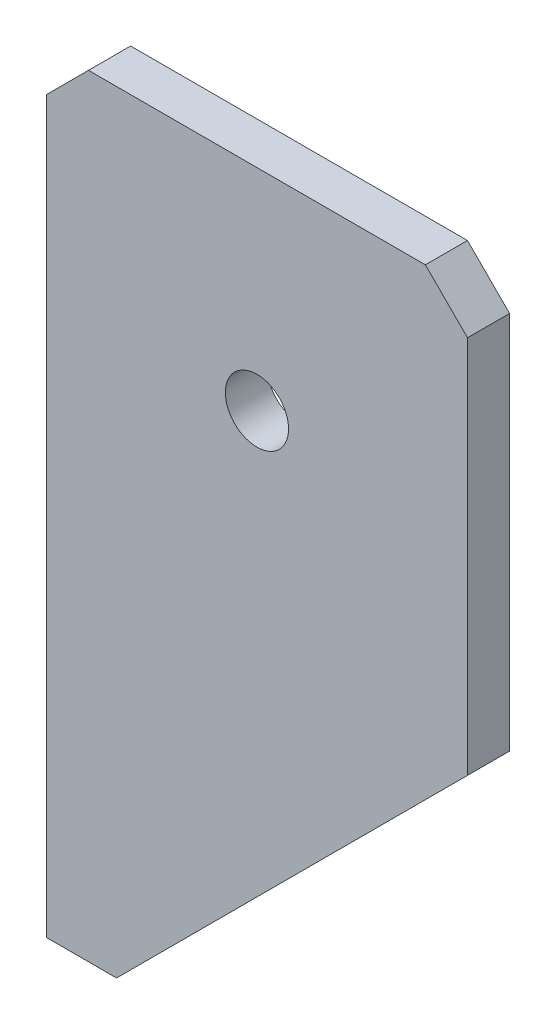
ISO-10303-21;
HEADER;
FILE_DESCRIPTION(('STEP AP214'),'2;1');
FILE_NAME('part.step','',(''),(''),'','','');
FILE_SCHEMA(('AUTOMOTIVE_DESIGN { 1 0 10303 214 1 1 1 1 }'));
ENDSEC;
DATA;
#1=APPLICATION_CONTEXT('core data for automotive mechanical design processes');
#2=APPLICATION_PROTOCOL_DEFINITION('international standard','automotive_design',2000,#1);
#3=PRODUCT_CONTEXT('',#1,'mechanical');
#4=PRODUCT('Part','Part','',(#3));
#5=PRODUCT_RELATED_PRODUCT_CATEGORY('part','',(#4));
#6=PRODUCT_DEFINITION_FORMATION('','',#4);
#7=PRODUCT_DEFINITION_CONTEXT('part definition',#1,'design');
#8=PRODUCT_DEFINITION('design','',#6,#7);
#9=PRODUCT_DEFINITION_SHAPE('','',#8);
#10=(LENGTH_UNIT() NAMED_UNIT(*) SI_UNIT(.MILLI.,.METRE.));
#11=(NAMED_UNIT(*) PLANE_ANGLE_UNIT() SI_UNIT($,.RADIAN.));
#12=(NAMED_UNIT(*) SI_UNIT($,.STERADIAN.) SOLID_ANGLE_UNIT());
#13=UNCERTAINTY_MEASURE_WITH_UNIT(LENGTH_MEASURE(1.E-05),#10,'distance_accuracy_value','');
#14=(GEOMETRIC_REPRESENTATION_CONTEXT(3) GLOBAL_UNCERTAINTY_ASSIGNED_CONTEXT((#13)) GLOBAL_UNIT_ASSIGNED_CONTEXT((#10,
#11,#12)) REPRESENTATION_CONTEXT('',''));
#15=CARTESIAN_POINT('',(0.,0.,0.));
#16=DIRECTION('',(0.,0.,1.));
#17=DIRECTION('',(1.,0.,0.));
#18=AXIS2_PLACEMENT_3D('',#15,#16,#17);
#19=CARTESIAN_POINT('',(15.,-27.5,1.5));
#20=DIRECTION('',(-1.,0.,0.));
#21=DIRECTION('',(0.,0.,1.));
#22=AXIS2_PLACEMENT_3D('',#19,#20,#21);
#23=PLANE('',#22);
#24=DIRECTION('',(0.,1.,0.));
#25=VECTOR('',#24,1.);
#26=CARTESIAN_POINT('',(15.,-27.5,1.5));
#27=LINE('',#26,#25);
#28=CARTESIAN_POINT('',(15.,-2.49999999999993,1.5));
#29=VERTEX_POINT('',#28);
#30=CARTESIAN_POINT('',(15.,24.5,1.5));
#31=VERTEX_POINT('',#30);
#32=EDGE_CURVE('E122',#29,#31,#27,.T.);
#33=ORIENTED_EDGE('',*,*,#32,.F.);
#34=DIRECTION('',(0.,0.,-1.));
#35=VECTOR('',#34,1.);
#36=CARTESIAN_POINT('',(15.,-2.49999999999993,1.5));
#37=LINE('',#36,#35);
#38=CARTESIAN_POINT('',(15.,-2.49999999999993,-1.5));
#39=VERTEX_POINT('',#38);
#40=EDGE_CURVE('E141',#29,#39,#37,.T.);
#41=ORIENTED_EDGE('',*,*,#40,.T.);
#42=DIRECTION('',(0.,1.,0.));
#43=VECTOR('',#42,1.);
#44=CARTESIAN_POINT('',(15.,-27.5,-1.5));
#45=LINE('',#44,#43);
#46=CARTESIAN_POINT('',(15.,24.5,-1.5));
#47=VERTEX_POINT('',#46);
#48=EDGE_CURVE('E114',#39,#47,#45,.T.);
#49=ORIENTED_EDGE('',*,*,#48,.T.);
#50=DIRECTION('',(0.,0.,1.));
#51=VECTOR('',#50,1.);
#52=CARTESIAN_POINT('',(15.,24.5,1.5));
#53=LINE('',#52,#51);
#54=EDGE_CURVE('E138',#47,#31,#53,.T.);
#55=ORIENTED_EDGE('',*,*,#54,.T.);
#56=EDGE_LOOP('',(#33,#41,#49,#55));
#57=FACE_BOUND('',#56,.T.);
#58=ADVANCED_FACE('F32',(#57),#23,.F.);
#59=CARTESIAN_POINT('',(-15.,27.5,1.5));
#60=DIRECTION('',(0.,-1.,0.));
#61=DIRECTION('',(0.,0.,-1.));
#62=AXIS2_PLACEMENT_3D('',#59,#60,#61);
#63=PLANE('',#62);
#64=DIRECTION('',(-1.,0.,0.));
#65=VECTOR('',#64,1.);
#66=CARTESIAN_POINT('',(-15.,27.5,-1.5));
#67=LINE('',#66,#65);
#68=CARTESIAN_POINT('',(12.,27.5,-1.5));
#69=VERTEX_POINT('',#68);
#70=CARTESIAN_POINT('',(-12.,27.5,-1.5));
#71=VERTEX_POINT('',#70);
#72=EDGE_CURVE('E116',#69,#71,#67,.T.);
#73=ORIENTED_EDGE('',*,*,#72,.T.);
#74=DIRECTION('',(0.,0.,1.));
#75=VECTOR('',#74,1.);
#76=CARTESIAN_POINT('',(-12.,27.5,1.5));
#77=LINE('',#76,#75);
#78=CARTESIAN_POINT('',(-12.,27.5,1.5));
#79=VERTEX_POINT('',#78);
#80=EDGE_CURVE('E133',#71,#79,#77,.T.);
#81=ORIENTED_EDGE('',*,*,#80,.T.);
#82=DIRECTION('',(-1.,0.,0.));
#83=VECTOR('',#82,1.);
#84=CARTESIAN_POINT('',(-15.,27.5,1.5));
#85=LINE('',#84,#83);
#86=CARTESIAN_POINT('',(12.,27.5,1.5));
#87=VERTEX_POINT('',#86);
#88=EDGE_CURVE('E101',#87,#79,#85,.T.);
#89=ORIENTED_EDGE('',*,*,#88,.F.);
#90=DIRECTION('',(0.,0.,-1.));
#91=VECTOR('',#90,1.);
#92=CARTESIAN_POINT('',(12.,27.5,1.5));
#93=LINE('',#92,#91);
#94=EDGE_CURVE('E130',#87,#69,#93,.T.);
#95=ORIENTED_EDGE('',*,*,#94,.T.);
#96=EDGE_LOOP('',(#73,#81,#89,#95));
#97=FACE_BOUND('',#96,.T.);
#98=ADVANCED_FACE('F160',(#97),#63,.F.);
#99=CARTESIAN_POINT('',(-15.,-27.5,1.5));
#100=DIRECTION('',(1.,0.,0.));
#101=DIRECTION('',(0.,0.,-1.));
#102=AXIS2_PLACEMENT_3D('',#99,#100,#101);
#103=PLANE('',#102);
#104=DIRECTION('',(0.,-1.,0.));
#105=VECTOR('',#104,1.);
#106=CARTESIAN_POINT('',(-15.,-27.5,1.5));
#107=LINE('',#106,#105);
#108=CARTESIAN_POINT('',(-15.,24.5,1.5));
#109=VERTEX_POINT('',#108);
#110=CARTESIAN_POINT('',(-15.,-27.5,1.5));
#111=VERTEX_POINT('',#110);
#112=EDGE_CURVE('E90',#109,#111,#107,.T.);
#113=ORIENTED_EDGE('',*,*,#112,.F.);
#114=DIRECTION('',(0.,0.,-1.));
#115=VECTOR('',#114,1.);
#116=CARTESIAN_POINT('',(-15.,24.5,1.5));
#117=LINE('',#116,#115);
#118=CARTESIAN_POINT('',(-15.,24.5,-1.5));
#119=VERTEX_POINT('',#118);
#120=EDGE_CURVE('E108',#109,#119,#117,.T.);
#121=ORIENTED_EDGE('',*,*,#120,.T.);
#122=DIRECTION('',(0.,-1.,0.));
#123=VECTOR('',#122,1.);
#124=CARTESIAN_POINT('',(-15.,-27.5,-1.5));
#125=LINE('',#124,#123);
#126=CARTESIAN_POINT('',(-15.,-27.5,-1.5));
#127=VERTEX_POINT('',#126);
#128=EDGE_CURVE('E107',#119,#127,#125,.T.);
#129=ORIENTED_EDGE('',*,*,#128,.T.);
#130=DIRECTION('',(0.,0.,-1.));
#131=VECTOR('',#130,1.);
#132=CARTESIAN_POINT('',(-15.,-27.5,1.5));
#133=LINE('',#132,#131);
#134=EDGE_CURVE('E104',#111,#127,#133,.T.);
#135=ORIENTED_EDGE('',*,*,#134,.F.);
#136=EDGE_LOOP('',(#113,#121,#129,#135));
#137=FACE_BOUND('',#136,.T.);
#138=ADVANCED_FACE('F105',(#137),#103,.F.);
#139=CARTESIAN_POINT('',(-15.,-27.5,1.5));
#140=DIRECTION('',(0.,1.,0.));
#141=DIRECTION('',(0.,0.,1.));
#142=AXIS2_PLACEMENT_3D('',#139,#140,#141);
#143=PLANE('',#142);
#144=DIRECTION('',(1.,0.,0.));
#145=VECTOR('',#144,1.);
#146=CARTESIAN_POINT('',(-15.,-27.5,-1.5));
#147=LINE('',#146,#145);
#148=CARTESIAN_POINT('',(-10.0000000000001,-27.5,-1.5));
#149=VERTEX_POINT('',#148);
#150=EDGE_CURVE('E121',#127,#149,#147,.T.);
#151=ORIENTED_EDGE('',*,*,#150,.T.);
#152=DIRECTION('',(0.,0.,1.));
#153=VECTOR('',#152,1.);
#154=CARTESIAN_POINT('',(-10.0000000000001,-27.5,1.5));
#155=LINE('',#154,#153);
#156=CARTESIAN_POINT('',(-10.0000000000001,-27.5,1.5));
#157=VERTEX_POINT('',#156);
#158=EDGE_CURVE('E40',#149,#157,#155,.T.);
#159=ORIENTED_EDGE('',*,*,#158,.T.);
#160=DIRECTION('',(1.,0.,0.));
#161=VECTOR('',#160,1.);
#162=CARTESIAN_POINT('',(-15.,-27.5,1.5));
#163=LINE('',#162,#161);
#164=EDGE_CURVE('E93',#111,#157,#163,.T.);
#165=ORIENTED_EDGE('',*,*,#164,.F.);
#166=ORIENTED_EDGE('',*,*,#134,.T.);
#167=EDGE_LOOP('',(#151,#159,#165,#166));
#168=FACE_BOUND('',#167,.T.);
#169=ADVANCED_FACE('F110',(#168),#143,.F.);
#170=CARTESIAN_POINT('',(0.,0.,1.5));
#171=DIRECTION('',(0.,0.,-1.));
#172=DIRECTION('',(-1.,0.,0.));
#173=AXIS2_PLACEMENT_3D('',#170,#171,#172);
#174=PLANE('',#173);
#175=CARTESIAN_POINT('',(0.,12.5,1.5));
#176=DIRECTION('',(0.,0.,1.));
#177=DIRECTION('',(1.,0.,0.));
#178=AXIS2_PLACEMENT_3D('',#175,#176,#177);
#179=CIRCLE('',#178,2.25);
#180=CARTESIAN_POINT('',(2.25,12.5,1.5));
#181=VERTEX_POINT('',#180);
#182=EDGE_CURVE('E144',#181,#181,#179,.T.);
#183=ORIENTED_EDGE('',*,*,#182,.F.);
#184=EDGE_LOOP('',(#183));
#185=FACE_BOUND('',#184,.T.);
#186=ORIENTED_EDGE('',*,*,#164,.T.);
#187=DIRECTION('',(-0.707106781186548,-0.707106781186548,0.));
#188=VECTOR('',#187,1.);
#189=CARTESIAN_POINT('',(15.,-2.49999999999993,1.5));
#190=LINE('',#189,#188);
#191=EDGE_CURVE('E11',#157,#29,#190,.F.);
#192=ORIENTED_EDGE('',*,*,#191,.T.);
#193=ORIENTED_EDGE('',*,*,#32,.T.);
#194=DIRECTION('',(0.707106781186547,-0.707106781186548,0.));
#195=VECTOR('',#194,1.);
#196=CARTESIAN_POINT('',(12.,27.5,1.5));
#197=LINE('',#196,#195);
#198=EDGE_CURVE('E135',#31,#87,#197,.F.);
#199=ORIENTED_EDGE('',*,*,#198,.T.);
#200=ORIENTED_EDGE('',*,*,#88,.T.);
#201=DIRECTION('',(0.707106781186548,0.707106781186548,0.));
#202=VECTOR('',#201,1.);
#203=CARTESIAN_POINT('',(-15.,24.5,1.5));
#204=LINE('',#203,#202);
#205=EDGE_CURVE('E97',#79,#109,#204,.F.);
#206=ORIENTED_EDGE('',*,*,#205,.T.);
#207=ORIENTED_EDGE('',*,*,#112,.T.);
#208=EDGE_LOOP('',(#186,#192,#193,#199,#200,#206,#207));
#209=FACE_BOUND('',#208,.T.);
#210=ADVANCED_FACE('F92',(#185,#209),#174,.F.);
#211=CARTESIAN_POINT('',(0.,0.,-1.5));
#212=DIRECTION('',(0.,0.,-1.));
#213=DIRECTION('',(-1.,0.,0.));
#214=AXIS2_PLACEMENT_3D('',#211,#212,#213);
#215=PLANE('',#214);
#216=CARTESIAN_POINT('',(0.,12.5,-1.5));
#217=DIRECTION('',(0.,0.,-1.));
#218=DIRECTION('',(-1.,0.,0.));
#219=AXIS2_PLACEMENT_3D('',#216,#217,#218);
#220=CIRCLE('',#219,2.25);
#221=CARTESIAN_POINT('',(-2.24999999999999,12.5,-1.5));
#222=VERTEX_POINT('',#221);
#223=EDGE_CURVE('E117',#222,#222,#220,.T.);
#224=ORIENTED_EDGE('',*,*,#223,.F.);
#225=EDGE_LOOP('',(#224));
#226=FACE_BOUND('',#225,.T.);
#227=ORIENTED_EDGE('',*,*,#48,.F.);
#228=DIRECTION('',(0.707106781186548,0.707106781186548,0.));
#229=VECTOR('',#228,1.);
#230=CARTESIAN_POINT('',(8.74999999999996,-8.74999999999996,-1.5));
#231=LINE('',#230,#229);
#232=EDGE_CURVE('E54',#39,#149,#231,.F.);
#233=ORIENTED_EDGE('',*,*,#232,.T.);
#234=ORIENTED_EDGE('',*,*,#150,.F.);
#235=ORIENTED_EDGE('',*,*,#128,.F.);
#236=DIRECTION('',(-0.707106781186548,-0.707106781186548,0.));
#237=VECTOR('',#236,1.);
#238=CARTESIAN_POINT('',(-19.75,19.75,-1.5));
#239=LINE('',#238,#237);
#240=EDGE_CURVE('E128',#119,#71,#239,.F.);
#241=ORIENTED_EDGE('',*,*,#240,.T.);
#242=ORIENTED_EDGE('',*,*,#72,.F.);
#243=DIRECTION('',(-0.707106781186547,0.707106781186548,0.));
#244=VECTOR('',#243,1.);
#245=CARTESIAN_POINT('',(19.75,19.75,-1.5));
#246=LINE('',#245,#244);
#247=EDGE_CURVE('E125',#69,#47,#246,.F.);
#248=ORIENTED_EDGE('',*,*,#247,.T.);
#249=EDGE_LOOP('',(#227,#233,#234,#235,#241,#242,#248));
#250=FACE_BOUND('',#249,.T.);
#251=ADVANCED_FACE('F151',(#226,#250),#215,.T.);
#252=CARTESIAN_POINT('',(-15.,24.5,1.5));
#253=DIRECTION('',(0.707106781186547,-0.707106781186547,0.));
#254=DIRECTION('',(0.,0.,-1.));
#255=AXIS2_PLACEMENT_3D('',#252,#253,#254);
#256=PLANE('',#255);
#257=ORIENTED_EDGE('',*,*,#205,.F.);
#258=ORIENTED_EDGE('',*,*,#80,.F.);
#259=ORIENTED_EDGE('',*,*,#240,.F.);
#260=ORIENTED_EDGE('',*,*,#120,.F.);
#261=EDGE_LOOP('',(#257,#258,#259,#260));
#262=FACE_BOUND('',#261,.T.);
#263=ADVANCED_FACE('F175',(#262),#256,.F.);
#264=CARTESIAN_POINT('',(12.,27.5,1.5));
#265=DIRECTION('',(-0.707106781186548,-0.707106781186547,0.));
#266=DIRECTION('',(0.,0.,-1.));
#267=AXIS2_PLACEMENT_3D('',#264,#265,#266);
#268=PLANE('',#267);
#269=ORIENTED_EDGE('',*,*,#198,.F.);
#270=ORIENTED_EDGE('',*,*,#54,.F.);
#271=ORIENTED_EDGE('',*,*,#247,.F.);
#272=ORIENTED_EDGE('',*,*,#94,.F.);
#273=EDGE_LOOP('',(#269,#270,#271,#272));
#274=FACE_BOUND('',#273,.T.);
#275=ADVANCED_FACE('F157',(#274),#268,.F.);
#276=CARTESIAN_POINT('',(0.,12.5,-8.5));
#277=DIRECTION('',(0.,0.,1.));
#278=DIRECTION('',(1.,0.,0.));
#279=AXIS2_PLACEMENT_3D('',#276,#277,#278);
#280=CYLINDRICAL_SURFACE('',#279,2.25);
#281=ORIENTED_EDGE('',*,*,#223,.T.);
#282=EDGE_LOOP('',(#281));
#283=FACE_BOUND('',#282,.T.);
#284=ORIENTED_EDGE('',*,*,#182,.T.);
#285=EDGE_LOOP('',(#284));
#286=FACE_BOUND('',#285,.T.);
#287=ADVANCED_FACE('F167',(#283,#286),#280,.F.);
#288=CARTESIAN_POINT('',(15.,-2.49999999999993,1.5));
#289=DIRECTION('',(-0.707106781186548,0.707106781186548,0.));
#290=DIRECTION('',(0.,0.,-1.));
#291=AXIS2_PLACEMENT_3D('',#288,#289,#290);
#292=PLANE('',#291);
#293=ORIENTED_EDGE('',*,*,#191,.F.);
#294=ORIENTED_EDGE('',*,*,#158,.F.);
#295=ORIENTED_EDGE('',*,*,#232,.F.);
#296=ORIENTED_EDGE('',*,*,#40,.F.);
#297=EDGE_LOOP('',(#293,#294,#295,#296));
#298=FACE_BOUND('',#297,.T.);
#299=ADVANCED_FACE('F34',(#298),#292,.F.);
#300=CLOSED_SHELL('',(#58,#98,#138,#169,#210,#251,#263,#275,#287,#299));
#301=MANIFOLD_SOLID_BREP('B2',#300);
#302=ADVANCED_BREP_SHAPE_REPRESENTATION('',(#18,#301),#14);
#303=SHAPE_DEFINITION_REPRESENTATION(#9,#302);
ENDSEC;
END-ISO-10303-21;
